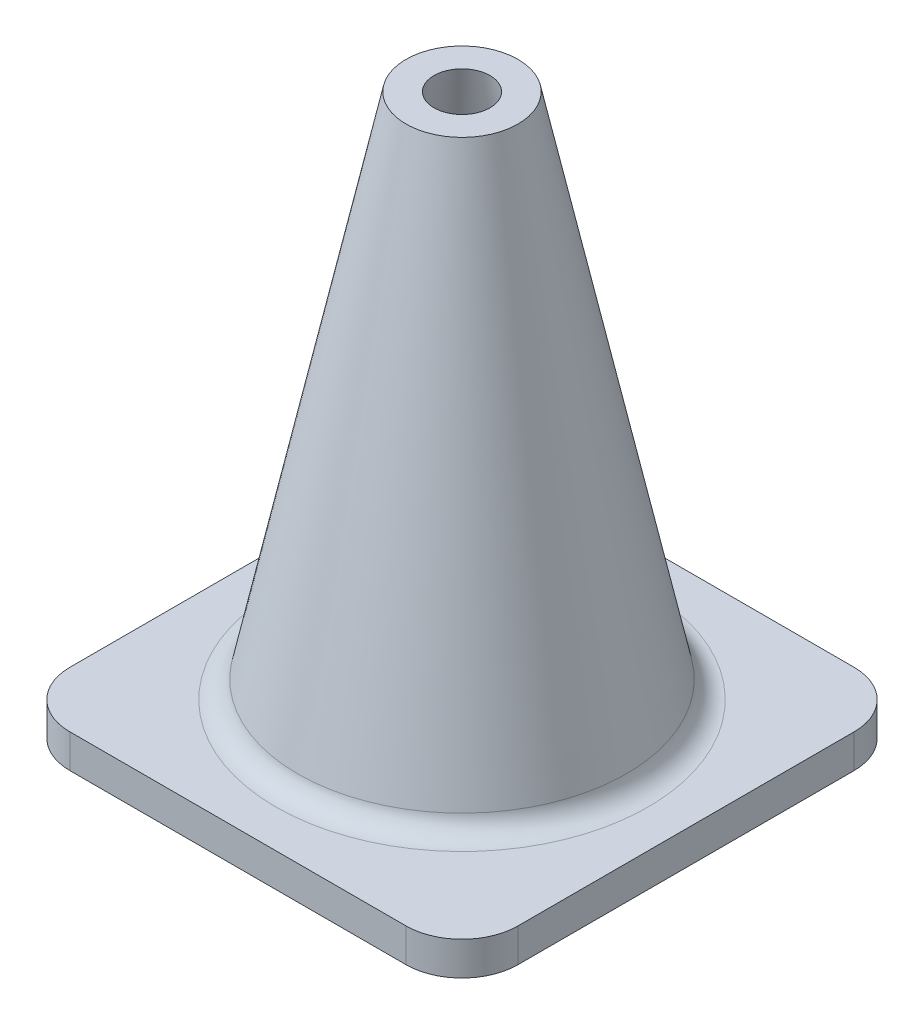
ISO-10303-21;
HEADER;
FILE_DESCRIPTION(('STEP AP214'),'2;1');
FILE_NAME('part.step','',(''),(''),'','','');
FILE_SCHEMA(('AUTOMOTIVE_DESIGN { 1 0 10303 214 1 1 1 1 }'));
ENDSEC;
DATA;
#1=APPLICATION_CONTEXT('core data for automotive mechanical design processes');
#2=APPLICATION_PROTOCOL_DEFINITION('international standard','automotive_design',2000,#1);
#3=PRODUCT_CONTEXT('',#1,'mechanical');
#4=PRODUCT('Part','Part','',(#3));
#5=PRODUCT_RELATED_PRODUCT_CATEGORY('part','',(#4));
#6=PRODUCT_DEFINITION_FORMATION('','',#4);
#7=PRODUCT_DEFINITION_CONTEXT('part definition',#1,'design');
#8=PRODUCT_DEFINITION('design','',#6,#7);
#9=PRODUCT_DEFINITION_SHAPE('','',#8);
#10=(LENGTH_UNIT() NAMED_UNIT(*) SI_UNIT(.MILLI.,.METRE.));
#11=(NAMED_UNIT(*) PLANE_ANGLE_UNIT() SI_UNIT($,.RADIAN.));
#12=(NAMED_UNIT(*) SI_UNIT($,.STERADIAN.) SOLID_ANGLE_UNIT());
#13=UNCERTAINTY_MEASURE_WITH_UNIT(LENGTH_MEASURE(1.E-05),#10,'distance_accuracy_value','');
#14=(GEOMETRIC_REPRESENTATION_CONTEXT(3) GLOBAL_UNCERTAINTY_ASSIGNED_CONTEXT((#13)) GLOBAL_UNIT_ASSIGNED_CONTEXT((#10,
#11,#12)) REPRESENTATION_CONTEXT('',''));
#15=CARTESIAN_POINT('',(0.,0.,0.));
#16=DIRECTION('',(0.,0.,1.));
#17=DIRECTION('',(1.,0.,0.));
#18=AXIS2_PLACEMENT_3D('',#15,#16,#17);
#19=CARTESIAN_POINT('',(0.,3.,0.));
#20=DIRECTION('',(0.,1.,0.));
#21=DIRECTION('',(0.,0.,1.));
#22=AXIS2_PLACEMENT_3D('',#19,#20,#21);
#23=PLANE('',#22);
#24=CARTESIAN_POINT('',(0.,3.,0.));
#25=DIRECTION('',(0.,1.,0.));
#26=DIRECTION('',(0.,0.,1.));
#27=AXIS2_PLACEMENT_3D('',#24,#25,#26);
#28=CIRCLE('',#27,16.6192363875292);
#29=CARTESIAN_POINT('',(0.,3.,16.6192363875292));
#30=VERTEX_POINT('',#29);
#31=EDGE_CURVE('E178',#30,#30,#28,.F.);
#32=ORIENTED_EDGE('',*,*,#31,.T.);
#33=EDGE_LOOP('',(#32));
#34=FACE_BOUND('',#33,.T.);
#35=DIRECTION('',(1.,0.,0.));
#36=VECTOR('',#35,1.);
#37=CARTESIAN_POINT('',(-20.,3.,20.));
#38=LINE('',#37,#36);
#39=CARTESIAN_POINT('',(-15.,3.,20.));
#40=VERTEX_POINT('',#39);
#41=CARTESIAN_POINT('',(15.,3.,20.));
#42=VERTEX_POINT('',#41);
#43=EDGE_CURVE('E143',#40,#42,#38,.T.);
#44=ORIENTED_EDGE('',*,*,#43,.T.);
#45=CARTESIAN_POINT('',(15.,3.,15.));
#46=DIRECTION('',(0.,1.,0.));
#47=DIRECTION('',(0.,0.,1.));
#48=AXIS2_PLACEMENT_3D('',#45,#46,#47);
#49=CIRCLE('',#48,5.);
#50=CARTESIAN_POINT('',(20.,3.,15.));
#51=VERTEX_POINT('',#50);
#52=EDGE_CURVE('E161',#42,#51,#49,.T.);
#53=ORIENTED_EDGE('',*,*,#52,.T.);
#54=DIRECTION('',(0.,0.,-1.));
#55=VECTOR('',#54,1.);
#56=CARTESIAN_POINT('',(20.,3.,-20.));
#57=LINE('',#56,#55);
#58=CARTESIAN_POINT('',(20.,3.,-15.));
#59=VERTEX_POINT('',#58);
#60=EDGE_CURVE('E126',#51,#59,#57,.T.);
#61=ORIENTED_EDGE('',*,*,#60,.T.);
#62=CARTESIAN_POINT('',(15.,3.,-15.));
#63=DIRECTION('',(0.,1.,0.));
#64=DIRECTION('',(0.,0.,1.));
#65=AXIS2_PLACEMENT_3D('',#62,#63,#64);
#66=CIRCLE('',#65,5.);
#67=CARTESIAN_POINT('',(15.,3.,-20.));
#68=VERTEX_POINT('',#67);
#69=EDGE_CURVE('E158',#59,#68,#66,.T.);
#70=ORIENTED_EDGE('',*,*,#69,.T.);
#71=DIRECTION('',(-1.,0.,0.));
#72=VECTOR('',#71,1.);
#73=CARTESIAN_POINT('',(-20.,3.,-20.));
#74=LINE('',#73,#72);
#75=CARTESIAN_POINT('',(-15.,3.,-20.));
#76=VERTEX_POINT('',#75);
#77=EDGE_CURVE('E259',#68,#76,#74,.T.);
#78=ORIENTED_EDGE('',*,*,#77,.T.);
#79=CARTESIAN_POINT('',(-15.,3.,-15.));
#80=DIRECTION('',(0.,1.,0.));
#81=DIRECTION('',(0.,0.,1.));
#82=AXIS2_PLACEMENT_3D('',#79,#80,#81);
#83=CIRCLE('',#82,5.);
#84=CARTESIAN_POINT('',(-20.,3.,-15.));
#85=VERTEX_POINT('',#84);
#86=EDGE_CURVE('E61',#76,#85,#83,.T.);
#87=ORIENTED_EDGE('',*,*,#86,.T.);
#88=DIRECTION('',(0.,0.,1.));
#89=VECTOR('',#88,1.);
#90=CARTESIAN_POINT('',(-20.,3.,-20.));
#91=LINE('',#90,#89);
#92=CARTESIAN_POINT('',(-20.,3.,15.));
#93=VERTEX_POINT('',#92);
#94=EDGE_CURVE('E260',#85,#93,#91,.T.);
#95=ORIENTED_EDGE('',*,*,#94,.T.);
#96=CARTESIAN_POINT('',(-15.,3.,15.));
#97=DIRECTION('',(0.,1.,0.));
#98=DIRECTION('',(0.,0.,1.));
#99=AXIS2_PLACEMENT_3D('',#96,#97,#98);
#100=CIRCLE('',#99,5.);
#101=EDGE_CURVE('E156',#93,#40,#100,.T.);
#102=ORIENTED_EDGE('',*,*,#101,.T.);
#103=EDGE_LOOP('',(#44,#53,#61,#70,#78,#87,#95,#102));
#104=FACE_BOUND('',#103,.T.);
#105=ADVANCED_FACE('F39',(#34,#104),#23,.T.);
#106=CARTESIAN_POINT('',(20.,3.,-20.));
#107=DIRECTION('',(-1.,0.,0.));
#108=DIRECTION('',(0.,0.,1.));
#109=AXIS2_PLACEMENT_3D('',#106,#107,#108);
#110=PLANE('',#109);
#111=ORIENTED_EDGE('',*,*,#60,.F.);
#112=DIRECTION('',(0.,-1.,0.));
#113=VECTOR('',#112,1.);
#114=CARTESIAN_POINT('',(20.,3.,15.));
#115=LINE('',#114,#113);
#116=CARTESIAN_POINT('',(20.,0.,15.));
#117=VERTEX_POINT('',#116);
#118=EDGE_CURVE('E110',#51,#117,#115,.T.);
#119=ORIENTED_EDGE('',*,*,#118,.T.);
#120=DIRECTION('',(0.,0.,-1.));
#121=VECTOR('',#120,1.);
#122=CARTESIAN_POINT('',(20.,0.,-20.));
#123=LINE('',#122,#121);
#124=CARTESIAN_POINT('',(20.,0.,-15.));
#125=VERTEX_POINT('',#124);
#126=EDGE_CURVE('E123',#117,#125,#123,.T.);
#127=ORIENTED_EDGE('',*,*,#126,.T.);
#128=DIRECTION('',(0.,-1.,0.));
#129=VECTOR('',#128,1.);
#130=CARTESIAN_POINT('',(20.,3.,-15.));
#131=LINE('',#130,#129);
#132=EDGE_CURVE('E128',#125,#59,#131,.F.);
#133=ORIENTED_EDGE('',*,*,#132,.T.);
#134=EDGE_LOOP('',(#111,#119,#127,#133));
#135=FACE_BOUND('',#134,.T.);
#136=ADVANCED_FACE('F122',(#135),#110,.F.);
#137=CARTESIAN_POINT('',(-20.,3.,-20.));
#138=DIRECTION('',(0.,0.,1.));
#139=DIRECTION('',(1.,0.,0.));
#140=AXIS2_PLACEMENT_3D('',#137,#138,#139);
#141=PLANE('',#140);
#142=DIRECTION('',(-1.,0.,0.));
#143=VECTOR('',#142,1.);
#144=CARTESIAN_POINT('',(-20.,0.,-20.));
#145=LINE('',#144,#143);
#146=CARTESIAN_POINT('',(15.,0.,-20.));
#147=VERTEX_POINT('',#146);
#148=CARTESIAN_POINT('',(-15.,0.,-20.));
#149=VERTEX_POINT('',#148);
#150=EDGE_CURVE('E133',#147,#149,#145,.T.);
#151=ORIENTED_EDGE('',*,*,#150,.T.);
#152=DIRECTION('',(0.,-1.,0.));
#153=VECTOR('',#152,1.);
#154=CARTESIAN_POINT('',(-15.,3.,-20.));
#155=LINE('',#154,#153);
#156=EDGE_CURVE('E170',#149,#76,#155,.F.);
#157=ORIENTED_EDGE('',*,*,#156,.T.);
#158=ORIENTED_EDGE('',*,*,#77,.F.);
#159=DIRECTION('',(0.,-1.,0.));
#160=VECTOR('',#159,1.);
#161=CARTESIAN_POINT('',(15.,3.,-20.));
#162=LINE('',#161,#160);
#163=EDGE_CURVE('E167',#68,#147,#162,.T.);
#164=ORIENTED_EDGE('',*,*,#163,.T.);
#165=EDGE_LOOP('',(#151,#157,#158,#164));
#166=FACE_BOUND('',#165,.T.);
#167=ADVANCED_FACE('F207',(#166),#141,.F.);
#168=CARTESIAN_POINT('',(-20.,3.,-20.));
#169=DIRECTION('',(1.,0.,0.));
#170=DIRECTION('',(0.,0.,-1.));
#171=AXIS2_PLACEMENT_3D('',#168,#169,#170);
#172=PLANE('',#171);
#173=ORIENTED_EDGE('',*,*,#94,.F.);
#174=DIRECTION('',(0.,-1.,0.));
#175=VECTOR('',#174,1.);
#176=CARTESIAN_POINT('',(-20.,3.,-15.));
#177=LINE('',#176,#175);
#178=CARTESIAN_POINT('',(-20.,0.,-15.));
#179=VERTEX_POINT('',#178);
#180=EDGE_CURVE('E164',#85,#179,#177,.T.);
#181=ORIENTED_EDGE('',*,*,#180,.T.);
#182=DIRECTION('',(0.,0.,1.));
#183=VECTOR('',#182,1.);
#184=CARTESIAN_POINT('',(-20.,0.,-20.));
#185=LINE('',#184,#183);
#186=CARTESIAN_POINT('',(-20.,0.,15.));
#187=VERTEX_POINT('',#186);
#188=EDGE_CURVE('E137',#179,#187,#185,.T.);
#189=ORIENTED_EDGE('',*,*,#188,.T.);
#190=DIRECTION('',(0.,-1.,0.));
#191=VECTOR('',#190,1.);
#192=CARTESIAN_POINT('',(-20.,3.,15.));
#193=LINE('',#192,#191);
#194=EDGE_CURVE('E54',#187,#93,#193,.F.);
#195=ORIENTED_EDGE('',*,*,#194,.T.);
#196=EDGE_LOOP('',(#173,#181,#189,#195));
#197=FACE_BOUND('',#196,.T.);
#198=ADVANCED_FACE('F219',(#197),#172,.F.);
#199=CARTESIAN_POINT('',(-20.,3.,20.));
#200=DIRECTION('',(0.,0.,-1.));
#201=DIRECTION('',(-1.,0.,0.));
#202=AXIS2_PLACEMENT_3D('',#199,#200,#201);
#203=PLANE('',#202);
#204=DIRECTION('',(1.,0.,0.));
#205=VECTOR('',#204,1.);
#206=CARTESIAN_POINT('',(-20.,0.,20.));
#207=LINE('',#206,#205);
#208=CARTESIAN_POINT('',(-15.,0.,20.));
#209=VERTEX_POINT('',#208);
#210=CARTESIAN_POINT('',(15.,0.,20.));
#211=VERTEX_POINT('',#210);
#212=EDGE_CURVE('E147',#209,#211,#207,.T.);
#213=ORIENTED_EDGE('',*,*,#212,.T.);
#214=DIRECTION('',(0.,-1.,0.));
#215=VECTOR('',#214,1.);
#216=CARTESIAN_POINT('',(15.,3.,20.));
#217=LINE('',#216,#215);
#218=EDGE_CURVE('E111',#211,#42,#217,.F.);
#219=ORIENTED_EDGE('',*,*,#218,.T.);
#220=ORIENTED_EDGE('',*,*,#43,.F.);
#221=DIRECTION('',(0.,-1.,0.));
#222=VECTOR('',#221,1.);
#223=CARTESIAN_POINT('',(-15.,3.,20.));
#224=LINE('',#223,#222);
#225=EDGE_CURVE('E116',#40,#209,#224,.T.);
#226=ORIENTED_EDGE('',*,*,#225,.T.);
#227=EDGE_LOOP('',(#213,#219,#220,#226));
#228=FACE_BOUND('',#227,.T.);
#229=ADVANCED_FACE('F215',(#228),#203,.F.);
#230=CARTESIAN_POINT('',(0.,0.,0.));
#231=DIRECTION('',(0.,1.,0.));
#232=DIRECTION('',(0.,0.,1.));
#233=AXIS2_PLACEMENT_3D('',#230,#231,#232);
#234=PLANE('',#233);
#235=CARTESIAN_POINT('',(0.,0.,0.));
#236=DIRECTION('',(0.,1.,0.));
#237=DIRECTION('',(0.,0.,1.));
#238=AXIS2_PLACEMENT_3D('',#235,#236,#237);
#239=CIRCLE('',#238,13.);
#240=CARTESIAN_POINT('',(0.,0.,13.));
#241=VERTEX_POINT('',#240);
#242=EDGE_CURVE('E11',#241,#241,#239,.T.);
#243=ORIENTED_EDGE('',*,*,#242,.T.);
#244=EDGE_LOOP('',(#243));
#245=FACE_BOUND('',#244,.T.);
#246=ORIENTED_EDGE('',*,*,#126,.F.);
#247=CARTESIAN_POINT('',(15.,0.,15.));
#248=DIRECTION('',(0.,1.,0.));
#249=DIRECTION('',(0.,0.,1.));
#250=AXIS2_PLACEMENT_3D('',#247,#248,#249);
#251=CIRCLE('',#250,5.);
#252=EDGE_CURVE('E106',#117,#211,#251,.F.);
#253=ORIENTED_EDGE('',*,*,#252,.T.);
#254=ORIENTED_EDGE('',*,*,#212,.F.);
#255=CARTESIAN_POINT('',(-15.,0.,15.));
#256=DIRECTION('',(0.,1.,0.));
#257=DIRECTION('',(0.,0.,1.));
#258=AXIS2_PLACEMENT_3D('',#255,#256,#257);
#259=CIRCLE('',#258,5.);
#260=EDGE_CURVE('E127',#209,#187,#259,.F.);
#261=ORIENTED_EDGE('',*,*,#260,.T.);
#262=ORIENTED_EDGE('',*,*,#188,.F.);
#263=CARTESIAN_POINT('',(-15.,0.,-15.));
#264=DIRECTION('',(0.,1.,0.));
#265=DIRECTION('',(0.,0.,1.));
#266=AXIS2_PLACEMENT_3D('',#263,#264,#265);
#267=CIRCLE('',#266,5.);
#268=EDGE_CURVE('E117',#179,#149,#267,.F.);
#269=ORIENTED_EDGE('',*,*,#268,.T.);
#270=ORIENTED_EDGE('',*,*,#150,.F.);
#271=CARTESIAN_POINT('',(15.,0.,-15.));
#272=DIRECTION('',(0.,1.,0.));
#273=DIRECTION('',(0.,0.,1.));
#274=AXIS2_PLACEMENT_3D('',#271,#272,#273);
#275=CIRCLE('',#274,5.);
#276=EDGE_CURVE('E132',#147,#125,#275,.F.);
#277=ORIENTED_EDGE('',*,*,#276,.T.);
#278=EDGE_LOOP('',(#246,#253,#254,#261,#262,#269,#270,#277));
#279=FACE_BOUND('',#278,.T.);
#280=ADVANCED_FACE('F130',(#245,#279),#234,.F.);
#281=CARTESIAN_POINT('',(0.,50.,0.));
#282=DIRECTION('',(0.,-1.,0.));
#283=DIRECTION('',(0.,0.,-1.));
#284=AXIS2_PLACEMENT_3D('',#281,#282,#283);
#285=CONICAL_SURFACE('',#284,5.,0.209639845874212);
#286=CARTESIAN_POINT('',(0.,4.58378471107028,0.));
#287=DIRECTION('',(0.,1.,0.));
#288=DIRECTION('',(0.,0.,1.));
#289=AXIS2_PLACEMENT_3D('',#286,#287,#288);
#290=CIRCLE('',#289,14.6630245295595);
#291=CARTESIAN_POINT('',(0.,4.58378471107028,14.6630245295595));
#292=VERTEX_POINT('',#291);
#293=EDGE_CURVE('E181',#292,#292,#290,.T.);
#294=ORIENTED_EDGE('',*,*,#293,.T.);
#295=EDGE_LOOP('',(#294));
#296=FACE_BOUND('',#295,.T.);
#297=CARTESIAN_POINT('',(0.,50.,0.));
#298=DIRECTION('',(0.,-1.,0.));
#299=DIRECTION('',(0.,0.,-1.));
#300=AXIS2_PLACEMENT_3D('',#297,#298,#299);
#301=CIRCLE('',#300,5.);
#302=CARTESIAN_POINT('',(0.,50.,-5.));
#303=VERTEX_POINT('',#302);
#304=EDGE_CURVE('E134',#303,#303,#301,.T.);
#305=ORIENTED_EDGE('',*,*,#304,.T.);
#306=EDGE_LOOP('',(#305));
#307=FACE_BOUND('',#306,.T.);
#308=ADVANCED_FACE('F211',(#296,#307),#285,.T.);
#309=CARTESIAN_POINT('',(-5.,50.,0.));
#310=DIRECTION('',(0.,-1.,0.));
#311=DIRECTION('',(0.,0.,-1.));
#312=AXIS2_PLACEMENT_3D('',#309,#310,#311);
#313=PLANE('',#312);
#314=ORIENTED_EDGE('',*,*,#304,.F.);
#315=EDGE_LOOP('',(#314));
#316=FACE_BOUND('',#315,.T.);
#317=CARTESIAN_POINT('',(0.,50.,0.));
#318=DIRECTION('',(0.,-1.,0.));
#319=DIRECTION('',(0.,0.,-1.));
#320=AXIS2_PLACEMENT_3D('',#317,#318,#319);
#321=CIRCLE('',#320,2.5);
#322=CARTESIAN_POINT('',(0.,50.,-2.5));
#323=VERTEX_POINT('',#322);
#324=EDGE_CURVE('E140',#323,#323,#321,.T.);
#325=ORIENTED_EDGE('',*,*,#324,.T.);
#326=EDGE_LOOP('',(#325));
#327=FACE_BOUND('',#326,.T.);
#328=ADVANCED_FACE('F251',(#316,#327),#313,.F.);
#329=CARTESIAN_POINT('',(0.,3.,0.));
#330=DIRECTION('',(0.,-1.,0.));
#331=DIRECTION('',(0.,0.,-1.));
#332=AXIS2_PLACEMENT_3D('',#329,#330,#331);
#333=CONICAL_SURFACE('',#332,12.5,0.209639845874212);
#334=CARTESIAN_POINT('',(0.,3.51451066885634,0.));
#335=DIRECTION('',(0.,-1.,0.));
#336=DIRECTION('',(0.,0.,-1.));
#337=AXIS2_PLACEMENT_3D('',#334,#335,#336);
#338=CIRCLE('',#337,12.3905296449242);
#339=CARTESIAN_POINT('',(0.,3.51451066885635,-12.3905296449242));
#340=VERTEX_POINT('',#339);
#341=EDGE_CURVE('E172',#340,#340,#338,.T.);
#342=CARTESIAN_POINT('',(0.,3.51451066885635,-12.3905296449242));
#343=CARTESIAN_POINT('',(0.,3.99873451605576,-12.2875032944562));
#344=CARTESIAN_POINT('',(0.,4.48295836325517,-12.1844769439883));
#345=CARTESIAN_POINT('',(0.,5.451406057654,-11.9784242430523));
#346=CARTESIAN_POINT('',(0.,5.93562990485341,-11.8753978925844));
#347=CARTESIAN_POINT('',(0.,6.90407759925224,-11.6693451916485));
#348=CARTESIAN_POINT('',(0.,7.38830144645165,-11.5663188411805));
#349=CARTESIAN_POINT('',(0.,8.35674914085048,-11.3602661402446));
#350=CARTESIAN_POINT('',(0.,8.84097298804989,-11.2572397897766));
#351=CARTESIAN_POINT('',(0.,9.80942068244872,-11.0511870888407));
#352=CARTESIAN_POINT('',(0.,10.2936445296481,-10.9481607383727));
#353=CARTESIAN_POINT('',(0.,11.262092224047,-10.7421080374368));
#354=CARTESIAN_POINT('',(0.,11.7463160712464,-10.6390816869689));
#355=CARTESIAN_POINT('',(0.,12.7147637656452,-10.4330289860329));
#356=CARTESIAN_POINT('',(0.,13.1989876128446,-10.330002635565));
#357=CARTESIAN_POINT('',(0.,14.1674353072434,-10.1239499346291));
#358=CARTESIAN_POINT('',(0.,14.6516591544428,-10.0209235841611));
#359=CARTESIAN_POINT('',(0.,15.6201068488417,-9.81487088322517));
#360=CARTESIAN_POINT('',(0.,16.1043306960411,-9.71184453275721));
#361=CARTESIAN_POINT('',(0.,17.0727783904399,-9.50579183182129));
#362=CARTESIAN_POINT('',(0.,17.5570022376393,-9.40276548135333));
#363=CARTESIAN_POINT('',(0.,18.5254499320381,-9.19671278041741));
#364=CARTESIAN_POINT('',(0.,19.0096737792376,-9.09368642994945));
#365=CARTESIAN_POINT('',(0.,19.9781214736364,-8.88763372901353));
#366=CARTESIAN_POINT('',(0.,20.4623453208358,-8.78460737854557));
#367=CARTESIAN_POINT('',(0.,21.4307930152346,-8.57855467760965));
#368=CARTESIAN_POINT('',(0.,21.915016862434,-8.47552832714169));
#369=CARTESIAN_POINT('',(0.,22.8834645568329,-8.26947562620577));
#370=CARTESIAN_POINT('',(0.,23.3676884040323,-8.16644927573781));
#371=CARTESIAN_POINT('',(0.,24.3361360984311,-7.96039657480189));
#372=CARTESIAN_POINT('',(0.,24.8203599456305,-7.85737022433393));
#373=CARTESIAN_POINT('',(0.,25.7888076400293,-7.65131752339801));
#374=CARTESIAN_POINT('',(0.,26.2730314872288,-7.54829117293005));
#375=CARTESIAN_POINT('',(0.,27.2414791816276,-7.34223847199413));
#376=CARTESIAN_POINT('',(0.,27.725703028827,-7.23921212152617));
#377=CARTESIAN_POINT('',(0.,28.6941507232258,-7.03315942059025));
#378=CARTESIAN_POINT('',(0.,29.1783745704252,-6.93013307012229));
#379=CARTESIAN_POINT('',(0.,30.1468222648241,-6.72408036918637));
#380=CARTESIAN_POINT('',(0.,30.6310461120235,-6.62105401871841));
#381=CARTESIAN_POINT('',(0.,31.5994938064223,-6.41500131778249));
#382=CARTESIAN_POINT('',(0.,32.0837176536217,-6.31197496731453));
#383=CARTESIAN_POINT('',(0.,33.0521653480205,-6.10592226637861));
#384=CARTESIAN_POINT('',(0.,33.53638919522,-6.00289591591065));
#385=CARTESIAN_POINT('',(0.,34.5048368896188,-5.79684321497473));
#386=CARTESIAN_POINT('',(0.,34.9890607368182,-5.69381686450677));
#387=CARTESIAN_POINT('',(0.,35.957508431217,-5.48776416357085));
#388=CARTESIAN_POINT('',(0.,36.4417322784164,-5.38473781310289));
#389=CARTESIAN_POINT('',(0.,37.4101799728153,-5.17868511216697));
#390=CARTESIAN_POINT('',(0.,37.8944038200147,-5.075658761699));
#391=CARTESIAN_POINT('',(0.,38.8628515144135,-4.86960606076309));
#392=CARTESIAN_POINT('',(0.,39.3470753616129,-4.76657971029512));
#393=CARTESIAN_POINT('',(0.,40.3155230560117,-4.5605270093592));
#394=CARTESIAN_POINT('',(0.,40.7997469032112,-4.45750065889124));
#395=CARTESIAN_POINT('',(0.,41.76819459761,-4.25144795795532));
#396=CARTESIAN_POINT('',(0.,42.2524184448094,-4.14842160748736));
#397=CARTESIAN_POINT('',(0.,43.2208661392082,-3.94236890655144));
#398=CARTESIAN_POINT('',(0.,43.7050899864076,-3.83934255608348));
#399=CARTESIAN_POINT('',(0.,44.6735376808065,-3.63328985514756));
#400=CARTESIAN_POINT('',(0.,45.1577615280059,-3.5302635046796));
#401=CARTESIAN_POINT('',(0.,46.1262092224047,-3.32421080374368));
#402=CARTESIAN_POINT('',(0.,46.6104330696041,-3.22118445327572));
#403=CARTESIAN_POINT('',(0.,47.5788807640029,-3.0151317523398));
#404=CARTESIAN_POINT('',(0.,48.0631046112023,-2.91210540187184));
#405=CARTESIAN_POINT('',(0.,49.0315523056012,-2.70605270093592));
#406=CARTESIAN_POINT('',(0.,49.5157761528006,-2.60302635046796));
#407=CARTESIAN_POINT('',(0.,50.,-2.5));
#408=B_SPLINE_CURVE_WITH_KNOTS('',3,(#342,#343,#344,#345,#346,#347,#348,#349,#350,#351,#352,
#353,#354,#355,#356,#357,#358,#359,#360,#361,#362,#363,#364,#365,#366,#367,#368,#369,#370,#371,
#372,#373,#374,#375,#376,#377,#378,#379,#380,#381,#382,#383,#384,#385,#386,#387,#388,#389,#390,
#391,#392,#393,#394,#395,#396,#397,#398,#399,#400,#401,#402,#403,#404,#405,#406,#407),
.UNSPECIFIED.,.F.,.F.,(4,2,2,2,2,2,2,2,2,2,2,2,2,2,2,2,2,2,2,2,2,2,2,2,2,2,2,2,2,2,2,2,4),(0.,
1.48518836104587,2.97037672209175,4.45556508313762,5.94075344418349,7.42594180522937,
8.91113016627524,10.3963185273211,11.881506888367,13.3666952494129,14.8518836104587,
16.3370719715046,17.8222603325505,19.3074486935964,20.7926370546422,22.2778254156881,
23.763013776734,25.2482021377799,26.7333904988257,28.2185788598716,29.7037672209175,
31.1889555819633,32.6741439430092,34.1593323040551,35.644520665101,37.1297090261468,
38.6148973871927,40.1000857482386,41.5852741092844,43.0704624703303,44.5556508313762,
46.040839192422,47.5260275534679),.UNSPECIFIED.);
#409=EDGE_CURVE('BSEAM229',#340,#323,#408,.T.);
#410=ORIENTED_EDGE('',*,*,#341,.T.);
#411=ORIENTED_EDGE('',*,*,#324,.F.);
#412=ORIENTED_EDGE('',*,*,#409,.T.);
#413=ORIENTED_EDGE('',*,*,#409,.F.);
#414=EDGE_LOOP('',(#410,#412,#411,#413));
#415=FACE_BOUND('',#414,.T.);
#416=ADVANCED_FACE('F229',(#415),#333,.F.);
#417=CARTESIAN_POINT('',(15.,3.,15.));
#418=DIRECTION('',(0.,-1.,0.));
#419=DIRECTION('',(0.,0.,-1.));
#420=AXIS2_PLACEMENT_3D('',#417,#418,#419);
#421=CYLINDRICAL_SURFACE('',#420,5.);
#422=ORIENTED_EDGE('',*,*,#52,.F.);
#423=ORIENTED_EDGE('',*,*,#218,.F.);
#424=ORIENTED_EDGE('',*,*,#252,.F.);
#425=ORIENTED_EDGE('',*,*,#118,.F.);
#426=EDGE_LOOP('',(#422,#423,#424,#425));
#427=FACE_BOUND('',#426,.T.);
#428=ADVANCED_FACE('F109',(#427),#421,.T.);
#429=CARTESIAN_POINT('',(-15.,3.,-15.));
#430=DIRECTION('',(0.,-1.,0.));
#431=DIRECTION('',(0.,0.,-1.));
#432=AXIS2_PLACEMENT_3D('',#429,#430,#431);
#433=CYLINDRICAL_SURFACE('',#432,5.);
#434=ORIENTED_EDGE('',*,*,#86,.F.);
#435=ORIENTED_EDGE('',*,*,#156,.F.);
#436=ORIENTED_EDGE('',*,*,#268,.F.);
#437=ORIENTED_EDGE('',*,*,#180,.F.);
#438=EDGE_LOOP('',(#434,#435,#436,#437));
#439=FACE_BOUND('',#438,.T.);
#440=ADVANCED_FACE('F228',(#439),#433,.T.);
#441=CARTESIAN_POINT('',(15.,3.,-15.));
#442=DIRECTION('',(0.,-1.,0.));
#443=DIRECTION('',(0.,0.,-1.));
#444=AXIS2_PLACEMENT_3D('',#441,#442,#443);
#445=CYLINDRICAL_SURFACE('',#444,5.);
#446=ORIENTED_EDGE('',*,*,#69,.F.);
#447=ORIENTED_EDGE('',*,*,#132,.F.);
#448=ORIENTED_EDGE('',*,*,#276,.F.);
#449=ORIENTED_EDGE('',*,*,#163,.F.);
#450=EDGE_LOOP('',(#446,#447,#448,#449));
#451=FACE_BOUND('',#450,.T.);
#452=ADVANCED_FACE('F232',(#451),#445,.T.);
#453=CARTESIAN_POINT('',(-15.,3.,15.));
#454=DIRECTION('',(0.,-1.,0.));
#455=DIRECTION('',(0.,0.,-1.));
#456=AXIS2_PLACEMENT_3D('',#453,#454,#455);
#457=CYLINDRICAL_SURFACE('',#456,5.);
#458=ORIENTED_EDGE('',*,*,#101,.F.);
#459=ORIENTED_EDGE('',*,*,#194,.F.);
#460=ORIENTED_EDGE('',*,*,#260,.F.);
#461=ORIENTED_EDGE('',*,*,#225,.F.);
#462=EDGE_LOOP('',(#458,#459,#460,#461));
#463=FACE_BOUND('',#462,.T.);
#464=ADVANCED_FACE('F236',(#463),#457,.T.);
#465=CARTESIAN_POINT('',(0.,50.001,0.));
#466=DIRECTION('',(0.,-1.,0.));
#467=DIRECTION('',(0.,0.,-1.));
#468=AXIS2_PLACEMENT_3D('',#465,#466,#467);
#469=CYLINDRICAL_SURFACE('',#468,12.5);
#470=CARTESIAN_POINT('',(0.,0.5,0.));
#471=DIRECTION('',(0.,1.,0.));
#472=DIRECTION('',(0.,0.,1.));
#473=AXIS2_PLACEMENT_3D('',#470,#471,#472);
#474=CIRCLE('',#473,12.5);
#475=CARTESIAN_POINT('',(0.,0.5,12.5));
#476=VERTEX_POINT('',#475);
#477=EDGE_CURVE('E47',#476,#476,#474,.F.);
#478=ORIENTED_EDGE('',*,*,#477,.T.);
#479=EDGE_LOOP('',(#478));
#480=FACE_BOUND('',#479,.T.);
#481=CARTESIAN_POINT('',(0.,2.47397244653205,0.));
#482=DIRECTION('',(0.,-1.,0.));
#483=DIRECTION('',(0.,0.,-1.));
#484=AXIS2_PLACEMENT_3D('',#481,#482,#483);
#485=CIRCLE('',#484,12.5);
#486=CARTESIAN_POINT('',(0.,2.47397244653205,-12.5));
#487=VERTEX_POINT('',#486);
#488=EDGE_CURVE('E175',#487,#487,#485,.F.);
#489=ORIENTED_EDGE('',*,*,#488,.T.);
#490=EDGE_LOOP('',(#489));
#491=FACE_BOUND('',#490,.T.);
#492=ADVANCED_FACE('F186',(#480,#491),#469,.F.);
#493=CARTESIAN_POINT('',(0.,2.47397244653205,0.));
#494=DIRECTION('',(0.,-1.,0.));
#495=DIRECTION('',(0.,0.,-1.));
#496=AXIS2_PLACEMENT_3D('',#493,#494,#495);
#497=TOROIDAL_SURFACE('',#496,7.5,5.);
#498=ORIENTED_EDGE('',*,*,#488,.F.);
#499=EDGE_LOOP('',(#498));
#500=FACE_BOUND('',#499,.T.);
#501=ORIENTED_EDGE('',*,*,#341,.F.);
#502=EDGE_LOOP('',(#501));
#503=FACE_BOUND('',#502,.T.);
#504=ADVANCED_FACE('F196',(#500,#503),#497,.F.);
#505=CARTESIAN_POINT('',(0.,5.,0.));
#506=DIRECTION('',(0.,1.,0.));
#507=DIRECTION('',(0.,0.,1.));
#508=AXIS2_PLACEMENT_3D('',#505,#506,#507);
#509=TOROIDAL_SURFACE('',#508,16.6192363875292,2.);
#510=ORIENTED_EDGE('',*,*,#293,.F.);
#511=EDGE_LOOP('',(#510));
#512=FACE_BOUND('',#511,.T.);
#513=ORIENTED_EDGE('',*,*,#31,.F.);
#514=EDGE_LOOP('',(#513));
#515=FACE_BOUND('',#514,.T.);
#516=ADVANCED_FACE('F190',(#512,#515),#509,.F.);
#517=CARTESIAN_POINT('',(0.,0.5,0.));
#518=DIRECTION('',(0.,1.,0.));
#519=DIRECTION('',(0.,0.,1.));
#520=AXIS2_PLACEMENT_3D('',#517,#518,#519);
#521=TOROIDAL_SURFACE('',#520,13.,0.5);
#522=ORIENTED_EDGE('',*,*,#242,.F.);
#523=EDGE_LOOP('',(#522));
#524=FACE_BOUND('',#523,.T.);
#525=ORIENTED_EDGE('',*,*,#477,.F.);
#526=EDGE_LOOP('',(#525));
#527=FACE_BOUND('',#526,.T.);
#528=ADVANCED_FACE('F41',(#524,#527),#521,.T.);
#529=CLOSED_SHELL('',(#105,#136,#167,#198,#229,#280,#308,#328,#416,#428,#440,#452,#464,#492,
#504,#516,#528));
#530=MANIFOLD_SOLID_BREP('B2',#529);
#531=ADVANCED_BREP_SHAPE_REPRESENTATION('',(#18,#530),#14);
#532=SHAPE_DEFINITION_REPRESENTATION(#9,#531);
ENDSEC;
END-ISO-10303-21;
